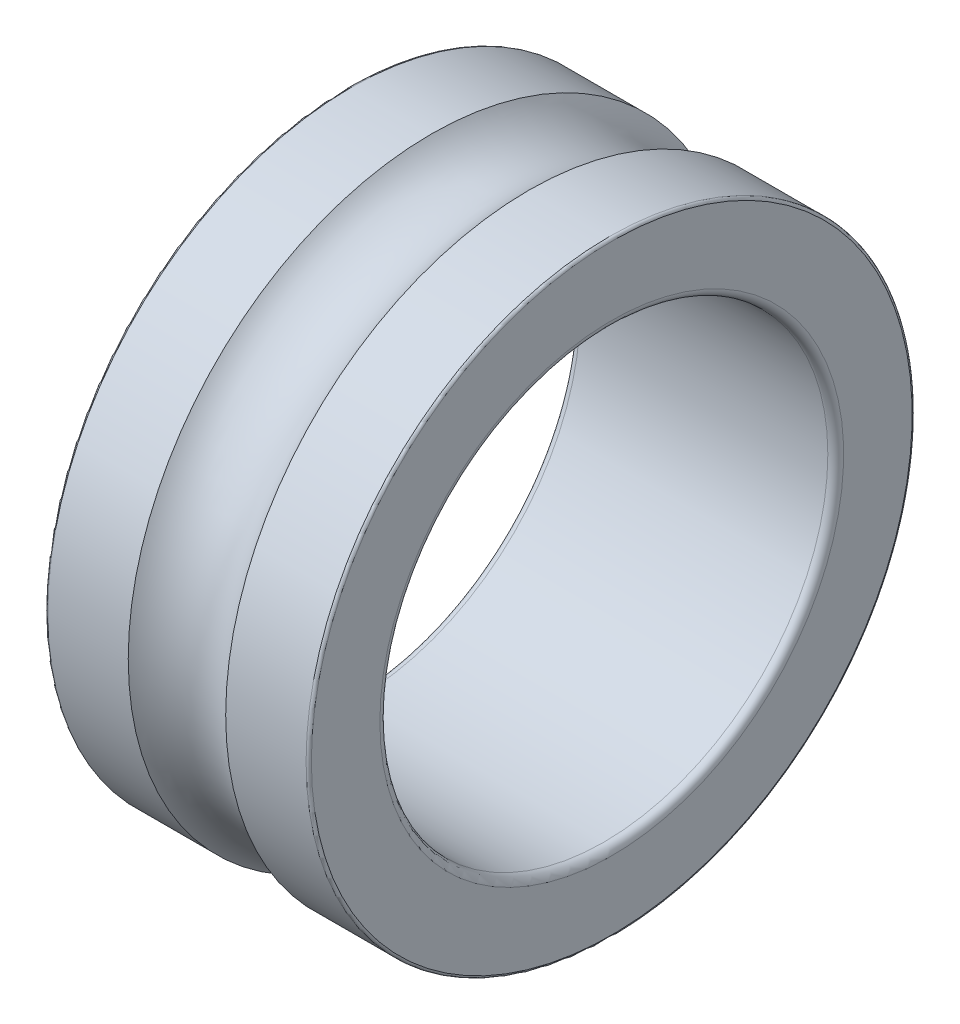
ISO-10303-21;
HEADER;
FILE_DESCRIPTION(('STEP AP214'),'2;1');
FILE_NAME('part.step','',(''),(''),'','','');
FILE_SCHEMA(('AUTOMOTIVE_DESIGN { 1 0 10303 214 1 1 1 1 }'));
ENDSEC;
DATA;
#1=APPLICATION_CONTEXT('core data for automotive mechanical design processes');
#2=APPLICATION_PROTOCOL_DEFINITION('international standard','automotive_design',2000,#1);
#3=PRODUCT_CONTEXT('',#1,'mechanical');
#4=PRODUCT('Part','Part','',(#3));
#5=PRODUCT_RELATED_PRODUCT_CATEGORY('part','',(#4));
#6=PRODUCT_DEFINITION_FORMATION('','',#4);
#7=PRODUCT_DEFINITION_CONTEXT('part definition',#1,'design');
#8=PRODUCT_DEFINITION('design','',#6,#7);
#9=PRODUCT_DEFINITION_SHAPE('','',#8);
#10=(LENGTH_UNIT() NAMED_UNIT(*) SI_UNIT(.MILLI.,.METRE.));
#11=(NAMED_UNIT(*) PLANE_ANGLE_UNIT() SI_UNIT($,.RADIAN.));
#12=(NAMED_UNIT(*) SI_UNIT($,.STERADIAN.) SOLID_ANGLE_UNIT());
#13=UNCERTAINTY_MEASURE_WITH_UNIT(LENGTH_MEASURE(1.E-05),#10,'distance_accuracy_value','');
#14=(GEOMETRIC_REPRESENTATION_CONTEXT(3) GLOBAL_UNCERTAINTY_ASSIGNED_CONTEXT((#13)) GLOBAL_UNIT_ASSIGNED_CONTEXT((#10,
#11,#12)) REPRESENTATION_CONTEXT('',''));
#15=CARTESIAN_POINT('',(0.,0.,0.));
#16=DIRECTION('',(0.,0.,1.));
#17=DIRECTION('',(1.,0.,0.));
#18=AXIS2_PLACEMENT_3D('',#15,#16,#17);
#19=CARTESIAN_POINT('',(0.299999999999937,0.,0.));
#20=DIRECTION('',(-1.,0.,0.));
#21=DIRECTION('',(0.,0.,1.));
#22=AXIS2_PLACEMENT_3D('',#19,#20,#21);
#23=TOROIDAL_SURFACE('',#22,8.79999999999994,0.299999999999937);
#24=CARTESIAN_POINT('',(0.299999999999995,0.,0.));
#25=DIRECTION('',(-1.,0.,0.));
#26=DIRECTION('',(0.,0.,1.));
#27=AXIS2_PLACEMENT_3D('',#24,#25,#26);
#28=CIRCLE('',#27,8.5);
#29=CARTESIAN_POINT('',(0.299999999999995,0.,8.5));
#30=VERTEX_POINT('',#29);
#31=EDGE_CURVE('E10',#30,#30,#28,.T.);
#32=ORIENTED_EDGE('',*,*,#31,.F.);
#33=EDGE_LOOP('',(#32));
#34=FACE_BOUND('',#33,.T.);
#35=CARTESIAN_POINT('',(0.,0.,0.));
#36=DIRECTION('',(-1.,0.,0.));
#37=DIRECTION('',(0.,0.,1.));
#38=AXIS2_PLACEMENT_3D('',#35,#36,#37);
#39=CIRCLE('',#38,8.8);
#40=CARTESIAN_POINT('',(0.,0.,8.8));
#41=VERTEX_POINT('',#40);
#42=EDGE_CURVE('E64',#41,#41,#39,.T.);
#43=ORIENTED_EDGE('',*,*,#42,.T.);
#44=EDGE_LOOP('',(#43));
#45=FACE_BOUND('',#44,.T.);
#46=ADVANCED_FACE('F30',(#34,#45),#23,.T.);
#47=CARTESIAN_POINT('',(100.,0.,0.));
#48=DIRECTION('',(-1.,0.,0.));
#49=DIRECTION('',(0.,0.,1.));
#50=AXIS2_PLACEMENT_3D('',#47,#48,#49);
#51=CYLINDRICAL_SURFACE('',#50,8.5);
#52=CARTESIAN_POINT('',(9.7,0.,0.));
#53=DIRECTION('',(-1.,0.,0.));
#54=DIRECTION('',(0.,0.,1.));
#55=AXIS2_PLACEMENT_3D('',#52,#53,#54);
#56=CIRCLE('',#55,8.5);
#57=CARTESIAN_POINT('',(9.7,0.,8.5));
#58=VERTEX_POINT('',#57);
#59=EDGE_CURVE('E36',#58,#58,#56,.T.);
#60=ORIENTED_EDGE('',*,*,#59,.F.);
#61=EDGE_LOOP('',(#60));
#62=FACE_BOUND('',#61,.T.);
#63=ORIENTED_EDGE('',*,*,#31,.T.);
#64=EDGE_LOOP('',(#63));
#65=FACE_BOUND('',#64,.T.);
#66=ADVANCED_FACE('F113',(#62,#65),#51,.F.);
#67=CARTESIAN_POINT('',(9.70000000000012,0.,0.));
#68=DIRECTION('',(-1.,0.,0.));
#69=DIRECTION('',(0.,0.,1.));
#70=AXIS2_PLACEMENT_3D('',#67,#68,#69);
#71=TOROIDAL_SURFACE('',#70,8.79999999999988,0.299999999999877);
#72=CARTESIAN_POINT('',(9.99999999999999,0.,0.));
#73=DIRECTION('',(-1.,0.,0.));
#74=DIRECTION('',(0.,0.,1.));
#75=AXIS2_PLACEMENT_3D('',#72,#73,#74);
#76=CIRCLE('',#75,8.8);
#77=CARTESIAN_POINT('',(9.99999999999999,0.,8.8));
#78=VERTEX_POINT('',#77);
#79=EDGE_CURVE('E40',#78,#78,#76,.T.);
#80=ORIENTED_EDGE('',*,*,#79,.F.);
#81=EDGE_LOOP('',(#80));
#82=FACE_BOUND('',#81,.T.);
#83=ORIENTED_EDGE('',*,*,#59,.T.);
#84=EDGE_LOOP('',(#83));
#85=FACE_BOUND('',#84,.T.);
#86=ADVANCED_FACE('F108',(#82,#85),#71,.T.);
#87=CARTESIAN_POINT('',(10.,8.8,0.));
#88=DIRECTION('',(-1.,0.,0.));
#89=DIRECTION('',(0.,0.,1.));
#90=AXIS2_PLACEMENT_3D('',#87,#88,#89);
#91=PLANE('',#90);
#92=CARTESIAN_POINT('',(9.99999999999999,0.,0.));
#93=DIRECTION('',(-1.,0.,0.));
#94=DIRECTION('',(0.,0.,1.));
#95=AXIS2_PLACEMENT_3D('',#92,#93,#94);
#96=CIRCLE('',#95,11.4);
#97=CARTESIAN_POINT('',(9.99999999999999,0.,11.4));
#98=VERTEX_POINT('',#97);
#99=EDGE_CURVE('E44',#98,#98,#96,.T.);
#100=ORIENTED_EDGE('',*,*,#99,.F.);
#101=EDGE_LOOP('',(#100));
#102=FACE_BOUND('',#101,.T.);
#103=ORIENTED_EDGE('',*,*,#79,.T.);
#104=EDGE_LOOP('',(#103));
#105=FACE_BOUND('',#104,.T.);
#106=ADVANCED_FACE('F102',(#102,#105),#91,.F.);
#107=CARTESIAN_POINT('',(9.90000000000067,0.,0.));
#108=DIRECTION('',(-1.,0.,0.));
#109=DIRECTION('',(0.,0.,1.));
#110=AXIS2_PLACEMENT_3D('',#107,#108,#109);
#111=TOROIDAL_SURFACE('',#110,11.4000000000007,0.0999999999993324);
#112=CARTESIAN_POINT('',(9.90000000000001,0.,0.));
#113=DIRECTION('',(-1.,0.,0.));
#114=DIRECTION('',(0.,0.,1.));
#115=AXIS2_PLACEMENT_3D('',#112,#113,#114);
#116=CIRCLE('',#115,11.5);
#117=CARTESIAN_POINT('',(9.90000000000001,0.,11.5));
#118=VERTEX_POINT('',#117);
#119=EDGE_CURVE('E49',#118,#118,#116,.T.);
#120=ORIENTED_EDGE('',*,*,#119,.F.);
#121=EDGE_LOOP('',(#120));
#122=FACE_BOUND('',#121,.T.);
#123=ORIENTED_EDGE('',*,*,#99,.T.);
#124=EDGE_LOOP('',(#123));
#125=FACE_BOUND('',#124,.T.);
#126=ADVANCED_FACE('F96',(#122,#125),#111,.T.);
#127=CARTESIAN_POINT('',(100.,0.,0.));
#128=DIRECTION('',(-1.,0.,0.));
#129=DIRECTION('',(0.,0.,1.));
#130=AXIS2_PLACEMENT_3D('',#127,#128,#129);
#131=CYLINDRICAL_SURFACE('',#130,11.5);
#132=CARTESIAN_POINT('',(6.8490973473563,0.,0.));
#133=DIRECTION('',(-1.,0.,0.));
#134=DIRECTION('',(0.,0.,1.));
#135=AXIS2_PLACEMENT_3D('',#132,#133,#134);
#136=CIRCLE('',#135,11.5);
#137=CARTESIAN_POINT('',(6.8490973473563,0.,11.5));
#138=VERTEX_POINT('',#137);
#139=EDGE_CURVE('E52',#138,#138,#136,.T.);
#140=ORIENTED_EDGE('',*,*,#139,.F.);
#141=EDGE_LOOP('',(#140));
#142=FACE_BOUND('',#141,.T.);
#143=ORIENTED_EDGE('',*,*,#119,.T.);
#144=EDGE_LOOP('',(#143));
#145=FACE_BOUND('',#144,.T.);
#146=ADVANCED_FACE('F90',(#142,#145),#131,.T.);
#147=CARTESIAN_POINT('',(5.,0.,0.));
#148=DIRECTION('',(-1.,0.,0.));
#149=DIRECTION('',(0.,0.,1.));
#150=AXIS2_PLACEMENT_3D('',#147,#148,#149);
#151=TOROIDAL_SURFACE('',#150,13.0000000000001,2.38100000000006);
#152=CARTESIAN_POINT('',(3.1509026526437,0.,0.));
#153=DIRECTION('',(-1.,0.,0.));
#154=DIRECTION('',(0.,0.,1.));
#155=AXIS2_PLACEMENT_3D('',#152,#153,#154);
#156=CIRCLE('',#155,11.5);
#157=CARTESIAN_POINT('',(3.1509026526437,0.,11.5));
#158=VERTEX_POINT('',#157);
#159=EDGE_CURVE('E55',#158,#158,#156,.T.);
#160=ORIENTED_EDGE('',*,*,#159,.F.);
#161=EDGE_LOOP('',(#160));
#162=FACE_BOUND('',#161,.T.);
#163=ORIENTED_EDGE('',*,*,#139,.T.);
#164=EDGE_LOOP('',(#163));
#165=FACE_BOUND('',#164,.T.);
#166=ADVANCED_FACE('F84',(#162,#165),#151,.F.);
#167=CARTESIAN_POINT('',(100.,0.,0.));
#168=DIRECTION('',(-1.,0.,0.));
#169=DIRECTION('',(0.,0.,1.));
#170=AXIS2_PLACEMENT_3D('',#167,#168,#169);
#171=CYLINDRICAL_SURFACE('',#170,11.5);
#172=CARTESIAN_POINT('',(0.100000000000003,0.,0.));
#173=DIRECTION('',(-1.,0.,0.));
#174=DIRECTION('',(0.,0.,1.));
#175=AXIS2_PLACEMENT_3D('',#172,#173,#174);
#176=CIRCLE('',#175,11.5);
#177=CARTESIAN_POINT('',(0.100000000000003,0.,11.5));
#178=VERTEX_POINT('',#177);
#179=EDGE_CURVE('E58',#178,#178,#176,.T.);
#180=ORIENTED_EDGE('',*,*,#179,.F.);
#181=EDGE_LOOP('',(#180));
#182=FACE_BOUND('',#181,.T.);
#183=ORIENTED_EDGE('',*,*,#159,.T.);
#184=EDGE_LOOP('',(#183));
#185=FACE_BOUND('',#184,.T.);
#186=ADVANCED_FACE('F78',(#182,#185),#171,.T.);
#187=CARTESIAN_POINT('',(0.0999999999994091,0.,0.));
#188=DIRECTION('',(-1.,0.,0.));
#189=DIRECTION('',(0.,0.,1.));
#190=AXIS2_PLACEMENT_3D('',#187,#188,#189);
#191=TOROIDAL_SURFACE('',#190,11.4000000000006,0.0999999999994093);
#192=CARTESIAN_POINT('',(0.,0.,0.));
#193=DIRECTION('',(-1.,0.,0.));
#194=DIRECTION('',(0.,0.,1.));
#195=AXIS2_PLACEMENT_3D('',#192,#193,#194);
#196=CIRCLE('',#195,11.4);
#197=CARTESIAN_POINT('',(0.,0.,11.4));
#198=VERTEX_POINT('',#197);
#199=EDGE_CURVE('E61',#198,#198,#196,.T.);
#200=ORIENTED_EDGE('',*,*,#199,.F.);
#201=EDGE_LOOP('',(#200));
#202=FACE_BOUND('',#201,.T.);
#203=ORIENTED_EDGE('',*,*,#179,.T.);
#204=EDGE_LOOP('',(#203));
#205=FACE_BOUND('',#204,.T.);
#206=ADVANCED_FACE('F72',(#202,#205),#191,.T.);
#207=CARTESIAN_POINT('',(0.,11.4,0.));
#208=DIRECTION('',(1.,0.,0.));
#209=DIRECTION('',(0.,0.,-1.));
#210=AXIS2_PLACEMENT_3D('',#207,#208,#209);
#211=PLANE('',#210);
#212=ORIENTED_EDGE('',*,*,#42,.F.);
#213=EDGE_LOOP('',(#212));
#214=FACE_BOUND('',#213,.T.);
#215=ORIENTED_EDGE('',*,*,#199,.T.);
#216=EDGE_LOOP('',(#215));
#217=FACE_BOUND('',#216,.T.);
#218=ADVANCED_FACE('F69',(#214,#217),#211,.F.);
#219=CLOSED_SHELL('',(#46,#66,#86,#106,#126,#146,#166,#186,#206,#218));
#220=MANIFOLD_SOLID_BREP('B2',#219);
#221=ADVANCED_BREP_SHAPE_REPRESENTATION('',(#18,#220),#14);
#222=SHAPE_DEFINITION_REPRESENTATION(#9,#221);
ENDSEC;
END-ISO-10303-21;
